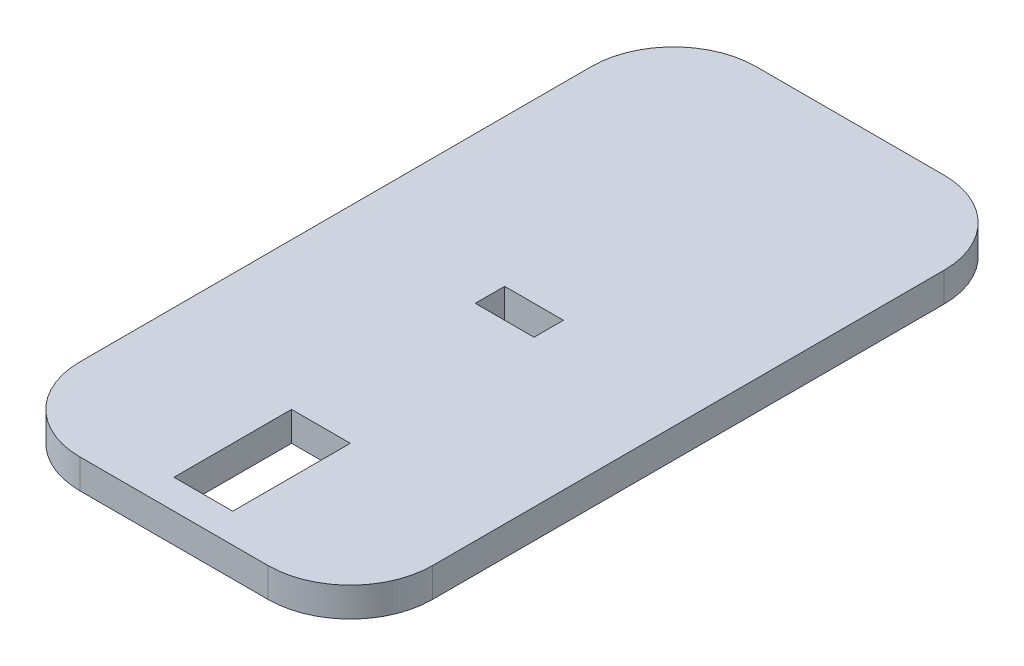
ISO-10303-21;
HEADER;
FILE_DESCRIPTION(('STEP AP214'),'2;1');
FILE_NAME('part.step','',(''),(''),'','','');
FILE_SCHEMA(('AUTOMOTIVE_DESIGN { 1 0 10303 214 1 1 1 1 }'));
ENDSEC;
DATA;
#1=APPLICATION_CONTEXT('core data for automotive mechanical design processes');
#2=APPLICATION_PROTOCOL_DEFINITION('international standard','automotive_design',2000,#1);
#3=PRODUCT_CONTEXT('',#1,'mechanical');
#4=PRODUCT('Part','Part','',(#3));
#5=PRODUCT_RELATED_PRODUCT_CATEGORY('part','',(#4));
#6=PRODUCT_DEFINITION_FORMATION('','',#4);
#7=PRODUCT_DEFINITION_CONTEXT('part definition',#1,'design');
#8=PRODUCT_DEFINITION('design','',#6,#7);
#9=PRODUCT_DEFINITION_SHAPE('','',#8);
#10=(LENGTH_UNIT() NAMED_UNIT(*) SI_UNIT(.MILLI.,.METRE.));
#11=(NAMED_UNIT(*) PLANE_ANGLE_UNIT() SI_UNIT($,.RADIAN.));
#12=(NAMED_UNIT(*) SI_UNIT($,.STERADIAN.) SOLID_ANGLE_UNIT());
#13=UNCERTAINTY_MEASURE_WITH_UNIT(LENGTH_MEASURE(1.E-05),#10,'distance_accuracy_value','');
#14=(GEOMETRIC_REPRESENTATION_CONTEXT(3) GLOBAL_UNCERTAINTY_ASSIGNED_CONTEXT((#13)) GLOBAL_UNIT_ASSIGNED_CONTEXT((#10,
#11,#12)) REPRESENTATION_CONTEXT('',''));
#15=CARTESIAN_POINT('',(0.,0.,0.));
#16=DIRECTION('',(0.,0.,1.));
#17=DIRECTION('',(1.,0.,0.));
#18=AXIS2_PLACEMENT_3D('',#15,#16,#17);
#19=CARTESIAN_POINT('',(17.78,6.35,-24.13));
#20=DIRECTION('',(0.,1.,0.));
#21=DIRECTION('',(0.,0.,1.));
#22=AXIS2_PLACEMENT_3D('',#19,#20,#21);
#23=PLANE('',#22);
#24=CARTESIAN_POINT('',(17.78,6.35,-24.13));
#25=DIRECTION('',(0.,1.,0.));
#26=DIRECTION('',(0.,0.,1.));
#27=AXIS2_PLACEMENT_3D('',#24,#25,#26);
#28=CIRCLE('',#27,17.78);
#29=CARTESIAN_POINT('',(0.,6.35,-24.1300000000001));
#30=VERTEX_POINT('',#29);
#31=CARTESIAN_POINT('',(17.7800000000001,6.35,-6.34999999999999));
#32=VERTEX_POINT('',#31);
#33=EDGE_CURVE('E213',#30,#32,#28,.T.);
#34=ORIENTED_EDGE('',*,*,#33,.T.);
#35=DIRECTION('',(1.,0.,0.));
#36=VECTOR('',#35,1.);
#37=CARTESIAN_POINT('',(17.7800000000001,6.35,-6.34999999999999));
#38=LINE('',#37,#36);
#39=CARTESIAN_POINT('',(58.4199999999999,6.35,-6.35));
#40=VERTEX_POINT('',#39);
#41=EDGE_CURVE('E216',#32,#40,#38,.T.);
#42=ORIENTED_EDGE('',*,*,#41,.T.);
#43=CARTESIAN_POINT('',(58.42,6.35,-24.13));
#44=DIRECTION('',(0.,1.,0.));
#45=DIRECTION('',(0.,0.,1.));
#46=AXIS2_PLACEMENT_3D('',#43,#44,#45);
#47=CIRCLE('',#46,17.78);
#48=CARTESIAN_POINT('',(76.2,6.35,-24.1300000000001));
#49=VERTEX_POINT('',#48);
#50=EDGE_CURVE('E219',#40,#49,#47,.T.);
#51=ORIENTED_EDGE('',*,*,#50,.T.);
#52=DIRECTION('',(0.,0.,-1.));
#53=VECTOR('',#52,1.);
#54=CARTESIAN_POINT('',(76.2,6.35,-24.1300000000001));
#55=LINE('',#54,#53);
#56=CARTESIAN_POINT('',(76.2,6.35,-134.62));
#57=VERTEX_POINT('',#56);
#58=EDGE_CURVE('E221',#49,#57,#55,.T.);
#59=ORIENTED_EDGE('',*,*,#58,.T.);
#60=CARTESIAN_POINT('',(58.42,6.35,-134.62));
#61=DIRECTION('',(0.,1.,0.));
#62=DIRECTION('',(0.,0.,-1.));
#63=AXIS2_PLACEMENT_3D('',#60,#61,#62);
#64=CIRCLE('',#63,17.78);
#65=CARTESIAN_POINT('',(58.4199999999999,6.35,-152.4));
#66=VERTEX_POINT('',#65);
#67=EDGE_CURVE('E223',#57,#66,#64,.T.);
#68=ORIENTED_EDGE('',*,*,#67,.T.);
#69=DIRECTION('',(-1.,0.,0.));
#70=VECTOR('',#69,1.);
#71=CARTESIAN_POINT('',(17.7800000000001,6.35,-152.4));
#72=LINE('',#71,#70);
#73=CARTESIAN_POINT('',(17.7800000000001,6.35,-152.4));
#74=VERTEX_POINT('',#73);
#75=EDGE_CURVE('E225',#66,#74,#72,.T.);
#76=ORIENTED_EDGE('',*,*,#75,.T.);
#77=CARTESIAN_POINT('',(17.78,6.35,-134.62));
#78=DIRECTION('',(0.,1.,0.));
#79=DIRECTION('',(0.,0.,-1.));
#80=AXIS2_PLACEMENT_3D('',#77,#78,#79);
#81=CIRCLE('',#80,17.78);
#82=CARTESIAN_POINT('',(0.,6.35,-134.62));
#83=VERTEX_POINT('',#82);
#84=EDGE_CURVE('E227',#74,#83,#81,.T.);
#85=ORIENTED_EDGE('',*,*,#84,.T.);
#86=DIRECTION('',(0.,0.,1.));
#87=VECTOR('',#86,1.);
#88=CARTESIAN_POINT('',(0.,6.35,-24.1300000000001));
#89=LINE('',#88,#87);
#90=EDGE_CURVE('E229',#83,#30,#89,.T.);
#91=ORIENTED_EDGE('',*,*,#90,.T.);
#92=EDGE_LOOP('',(#34,#42,#51,#59,#68,#76,#85,#91));
#93=FACE_BOUND('',#92,.T.);
#94=DIRECTION('',(-1.,0.,0.));
#95=VECTOR('',#94,1.);
#96=CARTESIAN_POINT('',(31.75,6.35,-84.1375));
#97=LINE('',#96,#95);
#98=CARTESIAN_POINT('',(44.45,6.35,-84.1375));
#99=VERTEX_POINT('',#98);
#100=CARTESIAN_POINT('',(31.75,6.35,-84.1375));
#101=VERTEX_POINT('',#100);
#102=EDGE_CURVE('E184',#99,#101,#97,.T.);
#103=ORIENTED_EDGE('',*,*,#102,.F.);
#104=DIRECTION('',(0.,0.,-1.));
#105=VECTOR('',#104,1.);
#106=CARTESIAN_POINT('',(44.45,6.35,-77.7875));
#107=LINE('',#106,#105);
#108=CARTESIAN_POINT('',(44.45,6.35,-77.7875));
#109=VERTEX_POINT('',#108);
#110=EDGE_CURVE('E182',#109,#99,#107,.T.);
#111=ORIENTED_EDGE('',*,*,#110,.F.);
#112=DIRECTION('',(1.,0.,0.));
#113=VECTOR('',#112,1.);
#114=CARTESIAN_POINT('',(31.75,6.35,-77.7875));
#115=LINE('',#114,#113);
#116=CARTESIAN_POINT('',(31.75,6.35,-77.7875));
#117=VERTEX_POINT('',#116);
#118=EDGE_CURVE('E190',#117,#109,#115,.T.);
#119=ORIENTED_EDGE('',*,*,#118,.F.);
#120=DIRECTION('',(0.,0.,1.));
#121=VECTOR('',#120,1.);
#122=CARTESIAN_POINT('',(31.75,6.35,-77.7875));
#123=LINE('',#122,#121);
#124=EDGE_CURVE('E187',#101,#117,#123,.T.);
#125=ORIENTED_EDGE('',*,*,#124,.F.);
#126=EDGE_LOOP('',(#103,#111,#119,#125));
#127=FACE_BOUND('',#126,.T.);
#128=DIRECTION('',(-1.,0.,0.));
#129=VECTOR('',#128,1.);
#130=CARTESIAN_POINT('',(31.75,6.35,-38.1));
#131=LINE('',#130,#129);
#132=CARTESIAN_POINT('',(44.45,6.35,-38.1));
#133=VERTEX_POINT('',#132);
#134=CARTESIAN_POINT('',(31.75,6.35,-38.1));
#135=VERTEX_POINT('',#134);
#136=EDGE_CURVE('E154',#133,#135,#131,.T.);
#137=ORIENTED_EDGE('',*,*,#136,.F.);
#138=DIRECTION('',(0.,0.,-1.));
#139=VECTOR('',#138,1.);
#140=CARTESIAN_POINT('',(44.45,6.35,-12.7));
#141=LINE('',#140,#139);
#142=CARTESIAN_POINT('',(44.45,6.35,-12.7));
#143=VERTEX_POINT('',#142);
#144=EDGE_CURVE('E146',#143,#133,#141,.T.);
#145=ORIENTED_EDGE('',*,*,#144,.F.);
#146=DIRECTION('',(1.,0.,0.));
#147=VECTOR('',#146,1.);
#148=CARTESIAN_POINT('',(31.75,6.35,-12.7));
#149=LINE('',#148,#147);
#150=CARTESIAN_POINT('',(31.75,6.35,-12.7));
#151=VERTEX_POINT('',#150);
#152=EDGE_CURVE('E168',#151,#143,#149,.T.);
#153=ORIENTED_EDGE('',*,*,#152,.F.);
#154=DIRECTION('',(0.,0.,1.));
#155=VECTOR('',#154,1.);
#156=CARTESIAN_POINT('',(31.75,6.35,-12.7));
#157=LINE('',#156,#155);
#158=EDGE_CURVE('E166',#135,#151,#157,.T.);
#159=ORIENTED_EDGE('',*,*,#158,.F.);
#160=EDGE_LOOP('',(#137,#145,#153,#159));
#161=FACE_BOUND('',#160,.T.);
#162=ADVANCED_FACE('F33',(#93,#127,#161),#23,.T.);
#163=CARTESIAN_POINT('',(17.78,0.,-24.13));
#164=DIRECTION('',(0.,1.,0.));
#165=DIRECTION('',(0.,0.,1.));
#166=AXIS2_PLACEMENT_3D('',#163,#164,#165);
#167=PLANE('',#166);
#168=DIRECTION('',(0.,0.,-1.));
#169=VECTOR('',#168,1.);
#170=CARTESIAN_POINT('',(44.45,0.,-77.7875));
#171=LINE('',#170,#169);
#172=CARTESIAN_POINT('',(44.45,0.,-77.7875));
#173=VERTEX_POINT('',#172);
#174=CARTESIAN_POINT('',(44.45,0.,-84.1375));
#175=VERTEX_POINT('',#174);
#176=EDGE_CURVE('E162',#173,#175,#171,.T.);
#177=ORIENTED_EDGE('',*,*,#176,.T.);
#178=DIRECTION('',(-1.,0.,0.));
#179=VECTOR('',#178,1.);
#180=CARTESIAN_POINT('',(31.75,0.,-84.1375));
#181=LINE('',#180,#179);
#182=CARTESIAN_POINT('',(31.75,0.,-84.1375));
#183=VERTEX_POINT('',#182);
#184=EDGE_CURVE('E195',#175,#183,#181,.T.);
#185=ORIENTED_EDGE('',*,*,#184,.T.);
#186=DIRECTION('',(0.,0.,1.));
#187=VECTOR('',#186,1.);
#188=CARTESIAN_POINT('',(31.75,0.,-77.7875));
#189=LINE('',#188,#187);
#190=CARTESIAN_POINT('',(31.75,0.,-77.7875));
#191=VERTEX_POINT('',#190);
#192=EDGE_CURVE('E198',#183,#191,#189,.T.);
#193=ORIENTED_EDGE('',*,*,#192,.T.);
#194=DIRECTION('',(1.,0.,0.));
#195=VECTOR('',#194,1.);
#196=CARTESIAN_POINT('',(31.75,0.,-77.7875));
#197=LINE('',#196,#195);
#198=EDGE_CURVE('E185',#191,#173,#197,.T.);
#199=ORIENTED_EDGE('',*,*,#198,.T.);
#200=EDGE_LOOP('',(#177,#185,#193,#199));
#201=FACE_BOUND('',#200,.T.);
#202=CARTESIAN_POINT('',(17.78,0.,-24.13));
#203=DIRECTION('',(0.,1.,0.));
#204=DIRECTION('',(0.,0.,1.));
#205=AXIS2_PLACEMENT_3D('',#202,#203,#204);
#206=CIRCLE('',#205,17.78);
#207=CARTESIAN_POINT('',(0.,0.,-24.1300000000001));
#208=VERTEX_POINT('',#207);
#209=CARTESIAN_POINT('',(17.7800000000001,0.,-6.34999999999999));
#210=VERTEX_POINT('',#209);
#211=EDGE_CURVE('E212',#208,#210,#206,.T.);
#212=ORIENTED_EDGE('',*,*,#211,.F.);
#213=DIRECTION('',(0.,0.,1.));
#214=VECTOR('',#213,1.);
#215=CARTESIAN_POINT('',(0.,0.,-24.1300000000001));
#216=LINE('',#215,#214);
#217=CARTESIAN_POINT('',(0.,0.,-134.62));
#218=VERTEX_POINT('',#217);
#219=EDGE_CURVE('E217',#218,#208,#216,.T.);
#220=ORIENTED_EDGE('',*,*,#219,.F.);
#221=CARTESIAN_POINT('',(17.78,0.,-134.62));
#222=DIRECTION('',(0.,1.,0.));
#223=DIRECTION('',(0.,0.,-1.));
#224=AXIS2_PLACEMENT_3D('',#221,#222,#223);
#225=CIRCLE('',#224,17.78);
#226=CARTESIAN_POINT('',(17.7800000000001,0.,-152.4));
#227=VERTEX_POINT('',#226);
#228=EDGE_CURVE('E244',#227,#218,#225,.T.);
#229=ORIENTED_EDGE('',*,*,#228,.F.);
#230=DIRECTION('',(-1.,0.,0.));
#231=VECTOR('',#230,1.);
#232=CARTESIAN_POINT('',(17.7800000000001,0.,-152.4));
#233=LINE('',#232,#231);
#234=CARTESIAN_POINT('',(58.4199999999999,0.,-152.4));
#235=VERTEX_POINT('',#234);
#236=EDGE_CURVE('E242',#235,#227,#233,.T.);
#237=ORIENTED_EDGE('',*,*,#236,.F.);
#238=CARTESIAN_POINT('',(58.42,0.,-134.62));
#239=DIRECTION('',(0.,1.,0.));
#240=DIRECTION('',(0.,0.,-1.));
#241=AXIS2_PLACEMENT_3D('',#238,#239,#240);
#242=CIRCLE('',#241,17.78);
#243=CARTESIAN_POINT('',(76.2,0.,-134.62));
#244=VERTEX_POINT('',#243);
#245=EDGE_CURVE('E240',#244,#235,#242,.T.);
#246=ORIENTED_EDGE('',*,*,#245,.F.);
#247=DIRECTION('',(0.,0.,-1.));
#248=VECTOR('',#247,1.);
#249=CARTESIAN_POINT('',(76.2,0.,-24.1300000000001));
#250=LINE('',#249,#248);
#251=CARTESIAN_POINT('',(76.2,0.,-24.1300000000001));
#252=VERTEX_POINT('',#251);
#253=EDGE_CURVE('E238',#252,#244,#250,.T.);
#254=ORIENTED_EDGE('',*,*,#253,.F.);
#255=CARTESIAN_POINT('',(58.42,0.,-24.13));
#256=DIRECTION('',(0.,1.,0.));
#257=DIRECTION('',(0.,0.,1.));
#258=AXIS2_PLACEMENT_3D('',#255,#256,#257);
#259=CIRCLE('',#258,17.78);
#260=CARTESIAN_POINT('',(58.4199999999999,0.,-6.35));
#261=VERTEX_POINT('',#260);
#262=EDGE_CURVE('E236',#261,#252,#259,.T.);
#263=ORIENTED_EDGE('',*,*,#262,.F.);
#264=DIRECTION('',(1.,0.,0.));
#265=VECTOR('',#264,1.);
#266=CARTESIAN_POINT('',(17.7800000000001,0.,-6.34999999999999));
#267=LINE('',#266,#265);
#268=EDGE_CURVE('E234',#210,#261,#267,.T.);
#269=ORIENTED_EDGE('',*,*,#268,.F.);
#270=EDGE_LOOP('',(#212,#220,#229,#237,#246,#254,#263,#269));
#271=FACE_BOUND('',#270,.T.);
#272=DIRECTION('',(0.,0.,-1.));
#273=VECTOR('',#272,1.);
#274=CARTESIAN_POINT('',(44.45,0.,-12.7));
#275=LINE('',#274,#273);
#276=CARTESIAN_POINT('',(44.45,0.,-12.7));
#277=VERTEX_POINT('',#276);
#278=CARTESIAN_POINT('',(44.45,0.,-38.1));
#279=VERTEX_POINT('',#278);
#280=EDGE_CURVE('E56',#277,#279,#275,.T.);
#281=ORIENTED_EDGE('',*,*,#280,.T.);
#282=DIRECTION('',(-1.,0.,0.));
#283=VECTOR('',#282,1.);
#284=CARTESIAN_POINT('',(31.75,0.,-38.1));
#285=LINE('',#284,#283);
#286=CARTESIAN_POINT('',(31.75,0.,-38.1));
#287=VERTEX_POINT('',#286);
#288=EDGE_CURVE('E161',#279,#287,#285,.T.);
#289=ORIENTED_EDGE('',*,*,#288,.T.);
#290=DIRECTION('',(0.,0.,1.));
#291=VECTOR('',#290,1.);
#292=CARTESIAN_POINT('',(31.75,0.,-12.7));
#293=LINE('',#292,#291);
#294=CARTESIAN_POINT('',(31.75,0.,-12.7));
#295=VERTEX_POINT('',#294);
#296=EDGE_CURVE('E174',#287,#295,#293,.T.);
#297=ORIENTED_EDGE('',*,*,#296,.T.);
#298=DIRECTION('',(1.,0.,0.));
#299=VECTOR('',#298,1.);
#300=CARTESIAN_POINT('',(31.75,0.,-12.7));
#301=LINE('',#300,#299);
#302=EDGE_CURVE('E155',#295,#277,#301,.T.);
#303=ORIENTED_EDGE('',*,*,#302,.T.);
#304=EDGE_LOOP('',(#281,#289,#297,#303));
#305=FACE_BOUND('',#304,.T.);
#306=ADVANCED_FACE('F274',(#201,#271,#305),#167,.F.);
#307=CARTESIAN_POINT('',(17.78,6.35,-24.13));
#308=DIRECTION('',(0.,-1.,0.));
#309=DIRECTION('',(0.,0.,-1.));
#310=AXIS2_PLACEMENT_3D('',#307,#308,#309);
#311=CYLINDRICAL_SURFACE('',#310,17.78);
#312=ORIENTED_EDGE('',*,*,#211,.T.);
#313=DIRECTION('',(0.,-1.,0.));
#314=VECTOR('',#313,1.);
#315=CARTESIAN_POINT('',(17.7800000000001,6.35,-6.34999999999999));
#316=LINE('',#315,#314);
#317=EDGE_CURVE('E11',#32,#210,#316,.T.);
#318=ORIENTED_EDGE('',*,*,#317,.F.);
#319=ORIENTED_EDGE('',*,*,#33,.F.);
#320=DIRECTION('',(0.,-1.,0.));
#321=VECTOR('',#320,1.);
#322=CARTESIAN_POINT('',(0.,6.35,-24.1300000000001));
#323=LINE('',#322,#321);
#324=EDGE_CURVE('E231',#30,#208,#323,.T.);
#325=ORIENTED_EDGE('',*,*,#324,.T.);
#326=EDGE_LOOP('',(#312,#318,#319,#325));
#327=FACE_BOUND('',#326,.T.);
#328=ADVANCED_FACE('F35',(#327),#311,.T.);
#329=CARTESIAN_POINT('',(17.7800000000001,6.35,-6.34999999999999));
#330=DIRECTION('',(0.,0.,-1.));
#331=DIRECTION('',(-1.,0.,0.));
#332=AXIS2_PLACEMENT_3D('',#329,#330,#331);
#333=PLANE('',#332);
#334=ORIENTED_EDGE('',*,*,#268,.T.);
#335=DIRECTION('',(0.,-1.,0.));
#336=VECTOR('',#335,1.);
#337=CARTESIAN_POINT('',(58.4199999999999,6.35,-6.35));
#338=LINE('',#337,#336);
#339=EDGE_CURVE('E41',#40,#261,#338,.T.);
#340=ORIENTED_EDGE('',*,*,#339,.F.);
#341=ORIENTED_EDGE('',*,*,#41,.F.);
#342=ORIENTED_EDGE('',*,*,#317,.T.);
#343=EDGE_LOOP('',(#334,#340,#341,#342));
#344=FACE_BOUND('',#343,.T.);
#345=ADVANCED_FACE('F292',(#344),#333,.F.);
#346=CARTESIAN_POINT('',(58.42,6.35,-24.13));
#347=DIRECTION('',(0.,-1.,0.));
#348=DIRECTION('',(0.,0.,-1.));
#349=AXIS2_PLACEMENT_3D('',#346,#347,#348);
#350=CYLINDRICAL_SURFACE('',#349,17.78);
#351=ORIENTED_EDGE('',*,*,#262,.T.);
#352=DIRECTION('',(0.,-1.,0.));
#353=VECTOR('',#352,1.);
#354=CARTESIAN_POINT('',(76.2,6.35,-24.1300000000001));
#355=LINE('',#354,#353);
#356=EDGE_CURVE('E261',#49,#252,#355,.T.);
#357=ORIENTED_EDGE('',*,*,#356,.F.);
#358=ORIENTED_EDGE('',*,*,#50,.F.);
#359=ORIENTED_EDGE('',*,*,#339,.T.);
#360=EDGE_LOOP('',(#351,#357,#358,#359));
#361=FACE_BOUND('',#360,.T.);
#362=ADVANCED_FACE('F268',(#361),#350,.T.);
#363=CARTESIAN_POINT('',(76.2,6.35,-24.1300000000001));
#364=DIRECTION('',(-1.,0.,0.));
#365=DIRECTION('',(0.,0.,1.));
#366=AXIS2_PLACEMENT_3D('',#363,#364,#365);
#367=PLANE('',#366);
#368=ORIENTED_EDGE('',*,*,#253,.T.);
#369=DIRECTION('',(0.,-1.,0.));
#370=VECTOR('',#369,1.);
#371=CARTESIAN_POINT('',(76.2,6.35,-134.62));
#372=LINE('',#371,#370);
#373=EDGE_CURVE('E258',#57,#244,#372,.T.);
#374=ORIENTED_EDGE('',*,*,#373,.F.);
#375=ORIENTED_EDGE('',*,*,#58,.F.);
#376=ORIENTED_EDGE('',*,*,#356,.T.);
#377=EDGE_LOOP('',(#368,#374,#375,#376));
#378=FACE_BOUND('',#377,.T.);
#379=ADVANCED_FACE('F280',(#378),#367,.F.);
#380=CARTESIAN_POINT('',(58.42,6.35,-134.62));
#381=DIRECTION('',(0.,-1.,0.));
#382=DIRECTION('',(0.,0.,-1.));
#383=AXIS2_PLACEMENT_3D('',#380,#381,#382);
#384=CYLINDRICAL_SURFACE('',#383,17.78);
#385=ORIENTED_EDGE('',*,*,#245,.T.);
#386=DIRECTION('',(0.,-1.,0.));
#387=VECTOR('',#386,1.);
#388=CARTESIAN_POINT('',(58.4199999999999,6.35,-152.4));
#389=LINE('',#388,#387);
#390=EDGE_CURVE('E255',#66,#235,#389,.T.);
#391=ORIENTED_EDGE('',*,*,#390,.F.);
#392=ORIENTED_EDGE('',*,*,#67,.F.);
#393=ORIENTED_EDGE('',*,*,#373,.T.);
#394=EDGE_LOOP('',(#385,#391,#392,#393));
#395=FACE_BOUND('',#394,.T.);
#396=ADVANCED_FACE('F284',(#395),#384,.T.);
#397=CARTESIAN_POINT('',(17.7800000000001,6.35,-152.4));
#398=DIRECTION('',(0.,0.,1.));
#399=DIRECTION('',(1.,0.,0.));
#400=AXIS2_PLACEMENT_3D('',#397,#398,#399);
#401=PLANE('',#400);
#402=ORIENTED_EDGE('',*,*,#236,.T.);
#403=DIRECTION('',(0.,-1.,0.));
#404=VECTOR('',#403,1.);
#405=CARTESIAN_POINT('',(17.7800000000001,6.35,-152.4));
#406=LINE('',#405,#404);
#407=EDGE_CURVE('E252',#74,#227,#406,.T.);
#408=ORIENTED_EDGE('',*,*,#407,.F.);
#409=ORIENTED_EDGE('',*,*,#75,.F.);
#410=ORIENTED_EDGE('',*,*,#390,.T.);
#411=EDGE_LOOP('',(#402,#408,#409,#410));
#412=FACE_BOUND('',#411,.T.);
#413=ADVANCED_FACE('F305',(#412),#401,.F.);
#414=CARTESIAN_POINT('',(17.78,6.35,-134.62));
#415=DIRECTION('',(0.,-1.,0.));
#416=DIRECTION('',(0.,0.,-1.));
#417=AXIS2_PLACEMENT_3D('',#414,#415,#416);
#418=CYLINDRICAL_SURFACE('',#417,17.78);
#419=ORIENTED_EDGE('',*,*,#228,.T.);
#420=DIRECTION('',(0.,-1.,0.));
#421=VECTOR('',#420,1.);
#422=CARTESIAN_POINT('',(0.,6.35,-134.62));
#423=LINE('',#422,#421);
#424=EDGE_CURVE('E249',#83,#218,#423,.T.);
#425=ORIENTED_EDGE('',*,*,#424,.F.);
#426=ORIENTED_EDGE('',*,*,#84,.F.);
#427=ORIENTED_EDGE('',*,*,#407,.T.);
#428=EDGE_LOOP('',(#419,#425,#426,#427));
#429=FACE_BOUND('',#428,.T.);
#430=ADVANCED_FACE('F303',(#429),#418,.T.);
#431=CARTESIAN_POINT('',(0.,6.35,-24.1300000000001));
#432=DIRECTION('',(1.,0.,0.));
#433=DIRECTION('',(0.,0.,-1.));
#434=AXIS2_PLACEMENT_3D('',#431,#432,#433);
#435=PLANE('',#434);
#436=ORIENTED_EDGE('',*,*,#219,.T.);
#437=ORIENTED_EDGE('',*,*,#324,.F.);
#438=ORIENTED_EDGE('',*,*,#90,.F.);
#439=ORIENTED_EDGE('',*,*,#424,.T.);
#440=EDGE_LOOP('',(#436,#437,#438,#439));
#441=FACE_BOUND('',#440,.T.);
#442=ADVANCED_FACE('F298',(#441),#435,.F.);
#443=CARTESIAN_POINT('',(44.45,6.35,-77.7875));
#444=DIRECTION('',(-1.,0.,0.));
#445=DIRECTION('',(0.,0.,1.));
#446=AXIS2_PLACEMENT_3D('',#443,#444,#445);
#447=PLANE('',#446);
#448=ORIENTED_EDGE('',*,*,#176,.F.);
#449=DIRECTION('',(0.,-1.,0.));
#450=VECTOR('',#449,1.);
#451=CARTESIAN_POINT('',(44.45,6.35,-77.7875));
#452=LINE('',#451,#450);
#453=EDGE_CURVE('E192',#109,#173,#452,.T.);
#454=ORIENTED_EDGE('',*,*,#453,.F.);
#455=ORIENTED_EDGE('',*,*,#110,.T.);
#456=DIRECTION('',(0.,-1.,0.));
#457=VECTOR('',#456,1.);
#458=CARTESIAN_POINT('',(44.45,6.35,-84.1375));
#459=LINE('',#458,#457);
#460=EDGE_CURVE('E209',#99,#175,#459,.T.);
#461=ORIENTED_EDGE('',*,*,#460,.T.);
#462=EDGE_LOOP('',(#448,#454,#455,#461));
#463=FACE_BOUND('',#462,.T.);
#464=ADVANCED_FACE('F322',(#463),#447,.T.);
#465=CARTESIAN_POINT('',(31.75,6.35,-84.1375));
#466=DIRECTION('',(0.,0.,1.));
#467=DIRECTION('',(1.,0.,0.));
#468=AXIS2_PLACEMENT_3D('',#465,#466,#467);
#469=PLANE('',#468);
#470=ORIENTED_EDGE('',*,*,#184,.F.);
#471=ORIENTED_EDGE('',*,*,#460,.F.);
#472=ORIENTED_EDGE('',*,*,#102,.T.);
#473=DIRECTION('',(0.,-1.,0.));
#474=VECTOR('',#473,1.);
#475=CARTESIAN_POINT('',(31.75,6.35,-84.1375));
#476=LINE('',#475,#474);
#477=EDGE_CURVE('E207',#101,#183,#476,.T.);
#478=ORIENTED_EDGE('',*,*,#477,.T.);
#479=EDGE_LOOP('',(#470,#471,#472,#478));
#480=FACE_BOUND('',#479,.T.);
#481=ADVANCED_FACE('F329',(#480),#469,.T.);
#482=CARTESIAN_POINT('',(31.75,6.35,-77.7875));
#483=DIRECTION('',(1.,0.,0.));
#484=DIRECTION('',(0.,0.,-1.));
#485=AXIS2_PLACEMENT_3D('',#482,#483,#484);
#486=PLANE('',#485);
#487=ORIENTED_EDGE('',*,*,#192,.F.);
#488=ORIENTED_EDGE('',*,*,#477,.F.);
#489=ORIENTED_EDGE('',*,*,#124,.T.);
#490=DIRECTION('',(0.,-1.,0.));
#491=VECTOR('',#490,1.);
#492=CARTESIAN_POINT('',(31.75,6.35,-77.7875));
#493=LINE('',#492,#491);
#494=EDGE_CURVE('E205',#117,#191,#493,.T.);
#495=ORIENTED_EDGE('',*,*,#494,.T.);
#496=EDGE_LOOP('',(#487,#488,#489,#495));
#497=FACE_BOUND('',#496,.T.);
#498=ADVANCED_FACE('F334',(#497),#486,.T.);
#499=CARTESIAN_POINT('',(31.75,6.35,-77.7875));
#500=DIRECTION('',(0.,0.,-1.));
#501=DIRECTION('',(-1.,0.,0.));
#502=AXIS2_PLACEMENT_3D('',#499,#500,#501);
#503=PLANE('',#502);
#504=ORIENTED_EDGE('',*,*,#198,.F.);
#505=ORIENTED_EDGE('',*,*,#494,.F.);
#506=ORIENTED_EDGE('',*,*,#118,.T.);
#507=ORIENTED_EDGE('',*,*,#453,.T.);
#508=EDGE_LOOP('',(#504,#505,#506,#507));
#509=FACE_BOUND('',#508,.T.);
#510=ADVANCED_FACE('F341',(#509),#503,.T.);
#511=CARTESIAN_POINT('',(44.45,6.35,-12.7));
#512=DIRECTION('',(-1.,0.,0.));
#513=DIRECTION('',(0.,0.,1.));
#514=AXIS2_PLACEMENT_3D('',#511,#512,#513);
#515=PLANE('',#514);
#516=ORIENTED_EDGE('',*,*,#280,.F.);
#517=DIRECTION('',(0.,-1.,0.));
#518=VECTOR('',#517,1.);
#519=CARTESIAN_POINT('',(44.45,6.35,-12.7));
#520=LINE('',#519,#518);
#521=EDGE_CURVE('E150',#143,#277,#520,.T.);
#522=ORIENTED_EDGE('',*,*,#521,.F.);
#523=ORIENTED_EDGE('',*,*,#144,.T.);
#524=DIRECTION('',(0.,-1.,0.));
#525=VECTOR('',#524,1.);
#526=CARTESIAN_POINT('',(44.45,6.35,-38.1));
#527=LINE('',#526,#525);
#528=EDGE_CURVE('E149',#133,#279,#527,.T.);
#529=ORIENTED_EDGE('',*,*,#528,.T.);
#530=EDGE_LOOP('',(#516,#522,#523,#529));
#531=FACE_BOUND('',#530,.T.);
#532=ADVANCED_FACE('F148',(#531),#515,.T.);
#533=CARTESIAN_POINT('',(31.75,6.35,-38.1));
#534=DIRECTION('',(0.,0.,1.));
#535=DIRECTION('',(1.,0.,0.));
#536=AXIS2_PLACEMENT_3D('',#533,#534,#535);
#537=PLANE('',#536);
#538=ORIENTED_EDGE('',*,*,#288,.F.);
#539=ORIENTED_EDGE('',*,*,#528,.F.);
#540=ORIENTED_EDGE('',*,*,#136,.T.);
#541=DIRECTION('',(0.,-1.,0.));
#542=VECTOR('',#541,1.);
#543=CARTESIAN_POINT('',(31.75,6.35,-38.1));
#544=LINE('',#543,#542);
#545=EDGE_CURVE('E163',#135,#287,#544,.T.);
#546=ORIENTED_EDGE('',*,*,#545,.T.);
#547=EDGE_LOOP('',(#538,#539,#540,#546));
#548=FACE_BOUND('',#547,.T.);
#549=ADVANCED_FACE('F158',(#548),#537,.T.);
#550=CARTESIAN_POINT('',(31.75,6.35,-12.7));
#551=DIRECTION('',(1.,0.,0.));
#552=DIRECTION('',(0.,0.,-1.));
#553=AXIS2_PLACEMENT_3D('',#550,#551,#552);
#554=PLANE('',#553);
#555=ORIENTED_EDGE('',*,*,#296,.F.);
#556=ORIENTED_EDGE('',*,*,#545,.F.);
#557=ORIENTED_EDGE('',*,*,#158,.T.);
#558=DIRECTION('',(0.,-1.,0.));
#559=VECTOR('',#558,1.);
#560=CARTESIAN_POINT('',(31.75,6.35,-12.7));
#561=LINE('',#560,#559);
#562=EDGE_CURVE('E48',#151,#295,#561,.T.);
#563=ORIENTED_EDGE('',*,*,#562,.T.);
#564=EDGE_LOOP('',(#555,#556,#557,#563));
#565=FACE_BOUND('',#564,.T.);
#566=ADVANCED_FACE('F359',(#565),#554,.T.);
#567=CARTESIAN_POINT('',(31.75,6.35,-12.7));
#568=DIRECTION('',(0.,0.,-1.));
#569=DIRECTION('',(-1.,0.,0.));
#570=AXIS2_PLACEMENT_3D('',#567,#568,#569);
#571=PLANE('',#570);
#572=ORIENTED_EDGE('',*,*,#302,.F.);
#573=ORIENTED_EDGE('',*,*,#562,.F.);
#574=ORIENTED_EDGE('',*,*,#152,.T.);
#575=ORIENTED_EDGE('',*,*,#521,.T.);
#576=EDGE_LOOP('',(#572,#573,#574,#575));
#577=FACE_BOUND('',#576,.T.);
#578=ADVANCED_FACE('F362',(#577),#571,.T.);
#579=CLOSED_SHELL('',(#162,#306,#328,#345,#362,#379,#396,#413,#430,#442,#464,#481,#498,#510,
#532,#549,#566,#578));
#580=MANIFOLD_SOLID_BREP('B2',#579);
#581=ADVANCED_BREP_SHAPE_REPRESENTATION('',(#18,#580),#14);
#582=SHAPE_DEFINITION_REPRESENTATION(#9,#581);
ENDSEC;
END-ISO-10303-21;
